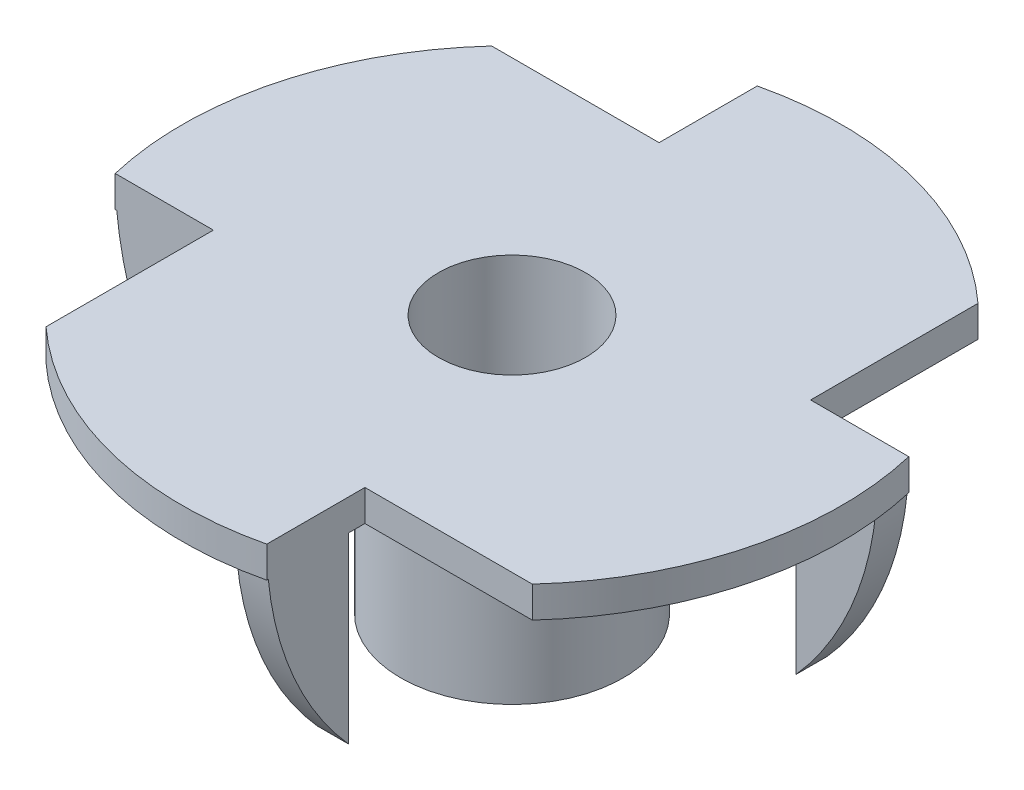
ISO-10303-21;
HEADER;
FILE_DESCRIPTION(('STEP AP214'),'2;1');
FILE_NAME('part.step','',(''),(''),'','','');
FILE_SCHEMA(('AUTOMOTIVE_DESIGN { 1 0 10303 214 1 1 1 1 }'));
ENDSEC;
DATA;
#1=APPLICATION_CONTEXT('core data for automotive mechanical design processes');
#2=APPLICATION_PROTOCOL_DEFINITION('international standard','automotive_design',2000,#1);
#3=PRODUCT_CONTEXT('',#1,'mechanical');
#4=PRODUCT('Part','Part','',(#3));
#5=PRODUCT_RELATED_PRODUCT_CATEGORY('part','',(#4));
#6=PRODUCT_DEFINITION_FORMATION('','',#4);
#7=PRODUCT_DEFINITION_CONTEXT('part definition',#1,'design');
#8=PRODUCT_DEFINITION('design','',#6,#7);
#9=PRODUCT_DEFINITION_SHAPE('','',#8);
#10=(LENGTH_UNIT() NAMED_UNIT(*) SI_UNIT(.MILLI.,.METRE.));
#11=(NAMED_UNIT(*) PLANE_ANGLE_UNIT() SI_UNIT($,.RADIAN.));
#12=(NAMED_UNIT(*) SI_UNIT($,.STERADIAN.) SOLID_ANGLE_UNIT());
#13=UNCERTAINTY_MEASURE_WITH_UNIT(LENGTH_MEASURE(1.E-05),#10,'distance_accuracy_value','');
#14=(GEOMETRIC_REPRESENTATION_CONTEXT(3) GLOBAL_UNCERTAINTY_ASSIGNED_CONTEXT((#13)) GLOBAL_UNIT_ASSIGNED_CONTEXT((#10,
#11,#12)) REPRESENTATION_CONTEXT('',''));
#15=CARTESIAN_POINT('',(0.,0.,0.));
#16=DIRECTION('',(0.,0.,1.));
#17=DIRECTION('',(1.,0.,0.));
#18=AXIS2_PLACEMENT_3D('',#15,#16,#17);
#19=CARTESIAN_POINT('',(0.,0.,0.));
#20=DIRECTION('',(0.,-1.,0.));
#21=DIRECTION('',(0.,0.,-1.));
#22=AXIS2_PLACEMENT_3D('',#19,#20,#21);
#23=CYLINDRICAL_SURFACE('',#22,7.4);
#24=DIRECTION('',(0.,-1.,0.));
#25=VECTOR('',#24,1.);
#26=CARTESIAN_POINT('',(-1.7,0.,-7.20208303201234));
#27=LINE('',#26,#25);
#28=CARTESIAN_POINT('',(-1.7,5.8,-7.20208303201234));
#29=VERTEX_POINT('',#28);
#30=CARTESIAN_POINT('',(-1.7,5.1,-7.20208303201234));
#31=VERTEX_POINT('',#30);
#32=EDGE_CURVE('E295',#29,#31,#27,.T.);
#33=ORIENTED_EDGE('',*,*,#32,.F.);
#34=CARTESIAN_POINT('',(0.,5.8,0.));
#35=DIRECTION('',(0.,-1.,0.));
#36=DIRECTION('',(0.,0.,-1.));
#37=AXIS2_PLACEMENT_3D('',#34,#35,#36);
#38=CIRCLE('',#37,7.4);
#39=CARTESIAN_POINT('',(5.,5.8,-5.45527267879434));
#40=VERTEX_POINT('',#39);
#41=EDGE_CURVE('E347',#29,#40,#38,.T.);
#42=ORIENTED_EDGE('',*,*,#41,.T.);
#43=DIRECTION('',(0.,-1.,0.));
#44=VECTOR('',#43,1.);
#45=CARTESIAN_POINT('',(5.,0.,-5.45527267879434));
#46=LINE('',#45,#44);
#47=CARTESIAN_POINT('',(5.,5.1,-5.45527267879434));
#48=VERTEX_POINT('',#47);
#49=EDGE_CURVE('E335',#48,#40,#46,.F.);
#50=ORIENTED_EDGE('',*,*,#49,.F.);
#51=CARTESIAN_POINT('',(0.,5.1,0.));
#52=DIRECTION('',(0.,-1.,0.));
#53=DIRECTION('',(0.,0.,-1.));
#54=AXIS2_PLACEMENT_3D('',#51,#52,#53);
#55=CIRCLE('',#54,7.4);
#56=EDGE_CURVE('E351',#31,#48,#55,.T.);
#57=ORIENTED_EDGE('',*,*,#56,.F.);
#58=EDGE_LOOP('',(#33,#42,#50,#57));
#59=FACE_BOUND('',#58,.T.);
#60=ADVANCED_FACE('F37',(#59),#23,.T.);
#61=DIRECTION('',(0.,-1.,0.));
#62=VECTOR('',#61,1.);
#63=CARTESIAN_POINT('',(-5.45527267879434,0.,-5.));
#64=LINE('',#63,#62);
#65=CARTESIAN_POINT('',(-5.45527267879434,5.1,-5.));
#66=VERTEX_POINT('',#65);
#67=CARTESIAN_POINT('',(-5.45527267879434,5.8,-5.));
#68=VERTEX_POINT('',#67);
#69=EDGE_CURVE('E289',#66,#68,#64,.F.);
#70=ORIENTED_EDGE('',*,*,#69,.F.);
#71=CARTESIAN_POINT('',(-7.20208303201234,5.1,1.7));
#72=VERTEX_POINT('',#71);
#73=EDGE_CURVE('E393',#72,#66,#55,.T.);
#74=ORIENTED_EDGE('',*,*,#73,.F.);
#75=DIRECTION('',(0.,-1.,0.));
#76=VECTOR('',#75,1.);
#77=CARTESIAN_POINT('',(-7.20208303201234,0.,1.7));
#78=LINE('',#77,#76);
#79=CARTESIAN_POINT('',(-7.20208303201234,5.8,1.7));
#80=VERTEX_POINT('',#79);
#81=EDGE_CURVE('E309',#80,#72,#78,.T.);
#82=ORIENTED_EDGE('',*,*,#81,.F.);
#83=EDGE_CURVE('E384',#80,#68,#38,.T.);
#84=ORIENTED_EDGE('',*,*,#83,.T.);
#85=EDGE_LOOP('',(#70,#74,#82,#84));
#86=FACE_BOUND('',#85,.T.);
#87=ADVANCED_FACE('F391',(#86),#23,.T.);
#88=DIRECTION('',(0.,-1.,0.));
#89=VECTOR('',#88,1.);
#90=CARTESIAN_POINT('',(-5.,0.,5.45527267879434));
#91=LINE('',#90,#89);
#92=CARTESIAN_POINT('',(-5.,5.1,5.45527267879434));
#93=VERTEX_POINT('',#92);
#94=CARTESIAN_POINT('',(-5.,5.8,5.45527267879434));
#95=VERTEX_POINT('',#94);
#96=EDGE_CURVE('E303',#93,#95,#91,.F.);
#97=ORIENTED_EDGE('',*,*,#96,.F.);
#98=CARTESIAN_POINT('',(1.7,5.1,7.20208303201234));
#99=VERTEX_POINT('',#98);
#100=EDGE_CURVE('E357',#99,#93,#55,.T.);
#101=ORIENTED_EDGE('',*,*,#100,.F.);
#102=DIRECTION('',(0.,-1.,0.));
#103=VECTOR('',#102,1.);
#104=CARTESIAN_POINT('',(1.7,0.,7.20208303201234));
#105=LINE('',#104,#103);
#106=CARTESIAN_POINT('',(1.7,5.8,7.20208303201234));
#107=VERTEX_POINT('',#106);
#108=EDGE_CURVE('E319',#107,#99,#105,.T.);
#109=ORIENTED_EDGE('',*,*,#108,.F.);
#110=EDGE_CURVE('E352',#107,#95,#38,.T.);
#111=ORIENTED_EDGE('',*,*,#110,.T.);
#112=EDGE_LOOP('',(#97,#101,#109,#111));
#113=FACE_BOUND('',#112,.T.);
#114=ADVANCED_FACE('F415',(#113),#23,.T.);
#115=CARTESIAN_POINT('',(0.,0.,0.));
#116=DIRECTION('',(0.,-1.,0.));
#117=DIRECTION('',(0.,0.,-1.));
#118=AXIS2_PLACEMENT_3D('',#115,#116,#117);
#119=PLANE('',#118);
#120=CARTESIAN_POINT('',(0.,0.,0.));
#121=DIRECTION('',(0.,-1.,0.));
#122=DIRECTION('',(0.,0.,-1.));
#123=AXIS2_PLACEMENT_3D('',#120,#121,#122);
#124=CIRCLE('',#123,1.65);
#125=CARTESIAN_POINT('',(0.,0.,-1.65));
#126=VERTEX_POINT('',#125);
#127=EDGE_CURVE('E344',#126,#126,#124,.T.);
#128=ORIENTED_EDGE('',*,*,#127,.F.);
#129=EDGE_LOOP('',(#128));
#130=FACE_BOUND('',#129,.T.);
#131=CARTESIAN_POINT('',(0.,0.,0.));
#132=DIRECTION('',(0.,-1.,0.));
#133=DIRECTION('',(0.,0.,-1.));
#134=AXIS2_PLACEMENT_3D('',#131,#132,#133);
#135=CIRCLE('',#134,2.5);
#136=CARTESIAN_POINT('',(0.,0.,-2.5));
#137=VERTEX_POINT('',#136);
#138=EDGE_CURVE('E360',#137,#137,#135,.T.);
#139=ORIENTED_EDGE('',*,*,#138,.T.);
#140=EDGE_LOOP('',(#139));
#141=FACE_BOUND('',#140,.T.);
#142=ADVANCED_FACE('F39',(#130,#141),#119,.T.);
#143=CARTESIAN_POINT('',(0.,0.,0.));
#144=DIRECTION('',(0.,-1.,0.));
#145=DIRECTION('',(0.,0.,-1.));
#146=AXIS2_PLACEMENT_3D('',#143,#144,#145);
#147=CYLINDRICAL_SURFACE('',#146,2.5);
#148=CARTESIAN_POINT('',(0.,5.1,0.));
#149=DIRECTION('',(0.,-1.,0.));
#150=DIRECTION('',(0.,0.,-1.));
#151=AXIS2_PLACEMENT_3D('',#148,#149,#150);
#152=CIRCLE('',#151,2.5);
#153=CARTESIAN_POINT('',(0.,5.1,-2.5));
#154=VERTEX_POINT('',#153);
#155=EDGE_CURVE('E356',#154,#154,#152,.T.);
#156=ORIENTED_EDGE('',*,*,#155,.T.);
#157=EDGE_LOOP('',(#156));
#158=FACE_BOUND('',#157,.T.);
#159=ORIENTED_EDGE('',*,*,#138,.F.);
#160=EDGE_LOOP('',(#159));
#161=FACE_BOUND('',#160,.T.);
#162=ADVANCED_FACE('F472',(#158,#161),#147,.T.);
#163=CARTESIAN_POINT('',(2.5,5.1,0.));
#164=DIRECTION('',(0.,-1.,0.));
#165=DIRECTION('',(0.,0.,-1.));
#166=AXIS2_PLACEMENT_3D('',#163,#164,#165);
#167=PLANE('',#166);
#168=DIRECTION('',(1.,0.,0.));
#169=VECTOR('',#168,1.);
#170=CARTESIAN_POINT('',(1.00000000000007,5.1,7.16798437498296));
#171=LINE('',#170,#169);
#172=CARTESIAN_POINT('',(1.70000000000007,5.1,7.16798437498295));
#173=VERTEX_POINT('',#172);
#174=CARTESIAN_POINT('',(1.00000000000007,5.1,7.16798437498296));
#175=VERTEX_POINT('',#174);
#176=EDGE_CURVE('E203',#173,#175,#171,.F.);
#177=ORIENTED_EDGE('',*,*,#176,.F.);
#178=DIRECTION('',(0.,0.,-1.));
#179=VECTOR('',#178,1.);
#180=CARTESIAN_POINT('',(1.7,5.1,0.));
#181=LINE('',#180,#179);
#182=EDGE_CURVE('E322',#99,#173,#181,.T.);
#183=ORIENTED_EDGE('',*,*,#182,.F.);
#184=ORIENTED_EDGE('',*,*,#100,.T.);
#185=DIRECTION('',(0.,0.,1.));
#186=VECTOR('',#185,1.);
#187=CARTESIAN_POINT('',(-5.,5.1,0.));
#188=LINE('',#187,#186);
#189=CARTESIAN_POINT('',(-5.,5.1,1.7));
#190=VERTEX_POINT('',#189);
#191=EDGE_CURVE('E301',#190,#93,#188,.T.);
#192=ORIENTED_EDGE('',*,*,#191,.F.);
#193=DIRECTION('',(1.,0.,0.));
#194=VECTOR('',#193,1.);
#195=CARTESIAN_POINT('',(2.5,5.1,1.7));
#196=LINE('',#195,#194);
#197=CARTESIAN_POINT('',(-5.36935750346352,5.1,1.7));
#198=VERTEX_POINT('',#197);
#199=EDGE_CURVE('E305',#198,#190,#196,.T.);
#200=ORIENTED_EDGE('',*,*,#199,.F.);
#201=DIRECTION('',(0.,0.,1.));
#202=VECTOR('',#201,1.);
#203=CARTESIAN_POINT('',(-5.36935750346352,5.1,0.));
#204=LINE('',#203,#202);
#205=CARTESIAN_POINT('',(-5.36935750346352,5.1,0.999999999999999));
#206=VERTEX_POINT('',#205);
#207=EDGE_CURVE('E236',#206,#198,#204,.T.);
#208=ORIENTED_EDGE('',*,*,#207,.F.);
#209=DIRECTION('',(-1.,0.,0.));
#210=VECTOR('',#209,1.);
#211=CARTESIAN_POINT('',(2.5,5.1,1.));
#212=LINE('',#211,#210);
#213=CARTESIAN_POINT('',(-7.16798437498297,5.1,0.999999999999998));
#214=VERTEX_POINT('',#213);
#215=EDGE_CURVE('E240',#206,#214,#212,.T.);
#216=ORIENTED_EDGE('',*,*,#215,.T.);
#217=DIRECTION('',(0.,0.,1.));
#218=VECTOR('',#217,1.);
#219=CARTESIAN_POINT('',(-7.16798437498297,5.1,0.999999999999998));
#220=LINE('',#219,#218);
#221=CARTESIAN_POINT('',(-7.16798437498297,5.1,1.7));
#222=VERTEX_POINT('',#221);
#223=EDGE_CURVE('E238',#222,#214,#220,.F.);
#224=ORIENTED_EDGE('',*,*,#223,.F.);
#225=EDGE_CURVE('E306',#72,#222,#196,.T.);
#226=ORIENTED_EDGE('',*,*,#225,.F.);
#227=ORIENTED_EDGE('',*,*,#73,.T.);
#228=DIRECTION('',(-1.,0.,0.));
#229=VECTOR('',#228,1.);
#230=CARTESIAN_POINT('',(2.5,5.1,-5.));
#231=LINE('',#230,#229);
#232=CARTESIAN_POINT('',(-1.7,5.1,-5.));
#233=VERTEX_POINT('',#232);
#234=EDGE_CURVE('E287',#233,#66,#231,.T.);
#235=ORIENTED_EDGE('',*,*,#234,.F.);
#236=DIRECTION('',(0.,0.,1.));
#237=VECTOR('',#236,1.);
#238=CARTESIAN_POINT('',(-1.7,5.1,0.));
#239=LINE('',#238,#237);
#240=CARTESIAN_POINT('',(-1.7,5.1,-5.36935750346352));
#241=VERTEX_POINT('',#240);
#242=EDGE_CURVE('E291',#241,#233,#239,.T.);
#243=ORIENTED_EDGE('',*,*,#242,.F.);
#244=DIRECTION('',(-1.,0.,0.));
#245=VECTOR('',#244,1.);
#246=CARTESIAN_POINT('',(2.49999999999998,5.1,-5.36935750346353));
#247=LINE('',#246,#245);
#248=CARTESIAN_POINT('',(-1.00000000000002,5.1,-5.36935750346352));
#249=VERTEX_POINT('',#248);
#250=EDGE_CURVE('E255',#249,#241,#247,.T.);
#251=ORIENTED_EDGE('',*,*,#250,.F.);
#252=DIRECTION('',(0.,0.,-1.));
#253=VECTOR('',#252,1.);
#254=CARTESIAN_POINT('',(-1.,5.1,0.));
#255=LINE('',#254,#253);
#256=CARTESIAN_POINT('',(-1.00000000000002,5.1,-7.16798437498297));
#257=VERTEX_POINT('',#256);
#258=EDGE_CURVE('E260',#249,#257,#255,.T.);
#259=ORIENTED_EDGE('',*,*,#258,.T.);
#260=DIRECTION('',(-1.,0.,0.));
#261=VECTOR('',#260,1.);
#262=CARTESIAN_POINT('',(-1.00000000000002,5.1,-7.16798437498297));
#263=LINE('',#262,#261);
#264=CARTESIAN_POINT('',(-1.70000000000002,5.1,-7.16798437498296));
#265=VERTEX_POINT('',#264);
#266=EDGE_CURVE('E258',#265,#257,#263,.F.);
#267=ORIENTED_EDGE('',*,*,#266,.F.);
#268=EDGE_CURVE('E292',#31,#265,#239,.T.);
#269=ORIENTED_EDGE('',*,*,#268,.F.);
#270=ORIENTED_EDGE('',*,*,#56,.T.);
#271=DIRECTION('',(0.,0.,-1.));
#272=VECTOR('',#271,1.);
#273=CARTESIAN_POINT('',(5.,5.1,0.));
#274=LINE('',#273,#272);
#275=CARTESIAN_POINT('',(5.,5.1,-1.7));
#276=VERTEX_POINT('',#275);
#277=EDGE_CURVE('E338',#276,#48,#274,.T.);
#278=ORIENTED_EDGE('',*,*,#277,.F.);
#279=DIRECTION('',(-1.,0.,0.));
#280=VECTOR('',#279,1.);
#281=CARTESIAN_POINT('',(2.5,5.1,-1.7));
#282=LINE('',#281,#280);
#283=CARTESIAN_POINT('',(5.36935750346352,5.1,-1.7));
#284=VERTEX_POINT('',#283);
#285=EDGE_CURVE('E331',#284,#276,#282,.T.);
#286=ORIENTED_EDGE('',*,*,#285,.F.);
#287=DIRECTION('',(0.,0.,-1.));
#288=VECTOR('',#287,1.);
#289=CARTESIAN_POINT('',(5.36935750346352,5.1,0.));
#290=LINE('',#289,#288);
#291=CARTESIAN_POINT('',(5.36935750346352,5.1,-0.999999999999999));
#292=VERTEX_POINT('',#291);
#293=EDGE_CURVE('E275',#292,#284,#290,.T.);
#294=ORIENTED_EDGE('',*,*,#293,.F.);
#295=DIRECTION('',(1.,0.,0.));
#296=VECTOR('',#295,1.);
#297=CARTESIAN_POINT('',(2.5,5.1,-0.999999999999999));
#298=LINE('',#297,#296);
#299=CARTESIAN_POINT('',(7.16798437498297,5.1,-0.999999999999998));
#300=VERTEX_POINT('',#299);
#301=EDGE_CURVE('E280',#292,#300,#298,.T.);
#302=ORIENTED_EDGE('',*,*,#301,.T.);
#303=DIRECTION('',(0.,0.,-1.));
#304=VECTOR('',#303,1.);
#305=CARTESIAN_POINT('',(7.16798437498297,5.1,-0.999999999999998));
#306=LINE('',#305,#304);
#307=CARTESIAN_POINT('',(7.16798437498297,5.1,-1.7));
#308=VERTEX_POINT('',#307);
#309=EDGE_CURVE('E278',#308,#300,#306,.F.);
#310=ORIENTED_EDGE('',*,*,#309,.F.);
#311=CARTESIAN_POINT('',(7.20208303201234,5.1,-1.7));
#312=VERTEX_POINT('',#311);
#313=EDGE_CURVE('E332',#312,#308,#282,.T.);
#314=ORIENTED_EDGE('',*,*,#313,.F.);
#315=CARTESIAN_POINT('',(5.45527267879434,5.1,5.));
#316=VERTEX_POINT('',#315);
#317=EDGE_CURVE('E353',#312,#316,#55,.T.);
#318=ORIENTED_EDGE('',*,*,#317,.T.);
#319=DIRECTION('',(1.,0.,0.));
#320=VECTOR('',#319,1.);
#321=CARTESIAN_POINT('',(2.5,5.1,5.));
#322=LINE('',#321,#320);
#323=CARTESIAN_POINT('',(1.7,5.1,5.));
#324=VERTEX_POINT('',#323);
#325=EDGE_CURVE('E317',#324,#316,#322,.T.);
#326=ORIENTED_EDGE('',*,*,#325,.F.);
#327=CARTESIAN_POINT('',(1.7,5.1,5.3693575034635));
#328=VERTEX_POINT('',#327);
#329=EDGE_CURVE('E321',#328,#324,#181,.T.);
#330=ORIENTED_EDGE('',*,*,#329,.F.);
#331=DIRECTION('',(1.,0.,0.));
#332=VECTOR('',#331,1.);
#333=CARTESIAN_POINT('',(2.50000000000006,5.1,5.36935750346349));
#334=LINE('',#333,#332);
#335=CARTESIAN_POINT('',(1.00000000000005,5.1,5.36935750346351));
#336=VERTEX_POINT('',#335);
#337=EDGE_CURVE('E213',#336,#328,#334,.T.);
#338=ORIENTED_EDGE('',*,*,#337,.F.);
#339=DIRECTION('',(0.,0.,1.));
#340=VECTOR('',#339,1.);
#341=CARTESIAN_POINT('',(1.,5.1,0.));
#342=LINE('',#341,#340);
#343=EDGE_CURVE('E216',#336,#175,#342,.T.);
#344=ORIENTED_EDGE('',*,*,#343,.T.);
#345=EDGE_LOOP('',(#177,#183,#184,#192,#200,#208,#216,#224,#226,#227,#235,#243,#251,#259,#267,
#269,#270,#278,#286,#294,#302,#310,#314,#318,#326,#330,#338,#344));
#346=FACE_BOUND('',#345,.T.);
#347=ORIENTED_EDGE('',*,*,#155,.F.);
#348=EDGE_LOOP('',(#347));
#349=FACE_BOUND('',#348,.T.);
#350=ADVANCED_FACE('F400',(#346,#349),#167,.T.);
#351=DIRECTION('',(0.,-1.,0.));
#352=VECTOR('',#351,1.);
#353=CARTESIAN_POINT('',(5.45527267879434,0.,5.));
#354=LINE('',#353,#352);
#355=CARTESIAN_POINT('',(5.45527267879434,5.8,5.));
#356=VERTEX_POINT('',#355);
#357=EDGE_CURVE('E315',#316,#356,#354,.F.);
#358=ORIENTED_EDGE('',*,*,#357,.F.);
#359=ORIENTED_EDGE('',*,*,#317,.F.);
#360=DIRECTION('',(0.,-1.,0.));
#361=VECTOR('',#360,1.);
#362=CARTESIAN_POINT('',(7.20208303201234,0.,-1.7));
#363=LINE('',#362,#361);
#364=CARTESIAN_POINT('',(7.20208303201234,5.8,-1.7));
#365=VERTEX_POINT('',#364);
#366=EDGE_CURVE('E329',#365,#312,#363,.T.);
#367=ORIENTED_EDGE('',*,*,#366,.F.);
#368=EDGE_CURVE('E348',#365,#356,#38,.T.);
#369=ORIENTED_EDGE('',*,*,#368,.T.);
#370=EDGE_LOOP('',(#358,#359,#367,#369));
#371=FACE_BOUND('',#370,.T.);
#372=ADVANCED_FACE('F430',(#371),#23,.T.);
#373=CARTESIAN_POINT('',(7.4,5.8,0.));
#374=DIRECTION('',(0.,1.,0.));
#375=DIRECTION('',(0.,0.,1.));
#376=AXIS2_PLACEMENT_3D('',#373,#374,#375);
#377=PLANE('',#376);
#378=ORIENTED_EDGE('',*,*,#110,.F.);
#379=DIRECTION('',(0.,0.,1.));
#380=VECTOR('',#379,1.);
#381=CARTESIAN_POINT('',(1.7,5.8,5.));
#382=LINE('',#381,#380);
#383=CARTESIAN_POINT('',(1.7,5.8,5.));
#384=VERTEX_POINT('',#383);
#385=EDGE_CURVE('E311',#384,#107,#382,.T.);
#386=ORIENTED_EDGE('',*,*,#385,.F.);
#387=DIRECTION('',(-1.,0.,0.));
#388=VECTOR('',#387,1.);
#389=CARTESIAN_POINT('',(7.4,5.8,5.));
#390=LINE('',#389,#388);
#391=EDGE_CURVE('E366',#356,#384,#390,.T.);
#392=ORIENTED_EDGE('',*,*,#391,.F.);
#393=ORIENTED_EDGE('',*,*,#368,.F.);
#394=DIRECTION('',(1.,0.,0.));
#395=VECTOR('',#394,1.);
#396=CARTESIAN_POINT('',(5.,5.8,-1.7));
#397=LINE('',#396,#395);
#398=CARTESIAN_POINT('',(5.,5.8,-1.7));
#399=VERTEX_POINT('',#398);
#400=EDGE_CURVE('E325',#399,#365,#397,.T.);
#401=ORIENTED_EDGE('',*,*,#400,.F.);
#402=DIRECTION('',(0.,0.,1.));
#403=VECTOR('',#402,1.);
#404=CARTESIAN_POINT('',(5.,5.8,0.));
#405=LINE('',#404,#403);
#406=EDGE_CURVE('E363',#40,#399,#405,.T.);
#407=ORIENTED_EDGE('',*,*,#406,.F.);
#408=ORIENTED_EDGE('',*,*,#41,.F.);
#409=DIRECTION('',(0.,0.,-1.));
#410=VECTOR('',#409,1.);
#411=CARTESIAN_POINT('',(-1.7,5.8,-5.));
#412=LINE('',#411,#410);
#413=CARTESIAN_POINT('',(-1.7,5.8,-5.));
#414=VERTEX_POINT('',#413);
#415=EDGE_CURVE('E283',#414,#29,#412,.T.);
#416=ORIENTED_EDGE('',*,*,#415,.F.);
#417=DIRECTION('',(1.,0.,0.));
#418=VECTOR('',#417,1.);
#419=CARTESIAN_POINT('',(7.4,5.8,-5.));
#420=LINE('',#419,#418);
#421=EDGE_CURVE('E11',#68,#414,#420,.T.);
#422=ORIENTED_EDGE('',*,*,#421,.F.);
#423=ORIENTED_EDGE('',*,*,#83,.F.);
#424=DIRECTION('',(-1.,0.,0.));
#425=VECTOR('',#424,1.);
#426=CARTESIAN_POINT('',(-5.,5.8,1.7));
#427=LINE('',#426,#425);
#428=CARTESIAN_POINT('',(-5.,5.8,1.7));
#429=VERTEX_POINT('',#428);
#430=EDGE_CURVE('E297',#429,#80,#427,.T.);
#431=ORIENTED_EDGE('',*,*,#430,.F.);
#432=DIRECTION('',(0.,0.,-1.));
#433=VECTOR('',#432,1.);
#434=CARTESIAN_POINT('',(-5.,5.8,0.));
#435=LINE('',#434,#433);
#436=EDGE_CURVE('E45',#95,#429,#435,.T.);
#437=ORIENTED_EDGE('',*,*,#436,.F.);
#438=EDGE_LOOP('',(#378,#386,#392,#393,#401,#407,#408,#416,#422,#423,#431,#437));
#439=FACE_BOUND('',#438,.T.);
#440=CARTESIAN_POINT('',(0.,5.8,0.));
#441=DIRECTION('',(0.,1.,0.));
#442=DIRECTION('',(0.,0.,1.));
#443=AXIS2_PLACEMENT_3D('',#440,#441,#442);
#444=CIRCLE('',#443,1.65);
#445=CARTESIAN_POINT('',(0.,5.8,1.65));
#446=VERTEX_POINT('',#445);
#447=EDGE_CURVE('E341',#446,#446,#444,.T.);
#448=ORIENTED_EDGE('',*,*,#447,.F.);
#449=EDGE_LOOP('',(#448));
#450=FACE_BOUND('',#449,.T.);
#451=ADVANCED_FACE('F380',(#439,#450),#377,.T.);
#452=CARTESIAN_POINT('',(0.,5.8,0.));
#453=DIRECTION('',(0.,1.,0.));
#454=DIRECTION('',(0.,0.,1.));
#455=AXIS2_PLACEMENT_3D('',#452,#453,#454);
#456=CYLINDRICAL_SURFACE('',#455,1.65);
#457=ORIENTED_EDGE('',*,*,#127,.T.);
#458=EDGE_LOOP('',(#457));
#459=FACE_BOUND('',#458,.T.);
#460=ORIENTED_EDGE('',*,*,#447,.T.);
#461=EDGE_LOOP('',(#460));
#462=FACE_BOUND('',#461,.T.);
#463=ADVANCED_FACE('F471',(#459,#462),#456,.F.);
#464=CARTESIAN_POINT('',(5.,-4.2,-1.7));
#465=DIRECTION('',(-1.,0.,0.));
#466=DIRECTION('',(0.,0.,1.));
#467=AXIS2_PLACEMENT_3D('',#464,#465,#466);
#468=PLANE('',#467);
#469=ORIENTED_EDGE('',*,*,#277,.T.);
#470=ORIENTED_EDGE('',*,*,#49,.T.);
#471=ORIENTED_EDGE('',*,*,#406,.T.);
#472=DIRECTION('',(0.,1.,0.));
#473=VECTOR('',#472,1.);
#474=CARTESIAN_POINT('',(5.,-4.2,-1.7));
#475=LINE('',#474,#473);
#476=EDGE_CURVE('E327',#276,#399,#475,.T.);
#477=ORIENTED_EDGE('',*,*,#476,.F.);
#478=EDGE_LOOP('',(#469,#470,#471,#477));
#479=FACE_BOUND('',#478,.T.);
#480=ADVANCED_FACE('F409',(#479),#468,.F.);
#481=CARTESIAN_POINT('',(5.,-4.2,-1.7));
#482=DIRECTION('',(0.,0.,1.));
#483=DIRECTION('',(1.,0.,0.));
#484=AXIS2_PLACEMENT_3D('',#481,#482,#483);
#485=PLANE('',#484);
#486=ORIENTED_EDGE('',*,*,#400,.T.);
#487=ORIENTED_EDGE('',*,*,#366,.T.);
#488=ORIENTED_EDGE('',*,*,#313,.T.);
#489=CARTESIAN_POINT('',(0.,5.8,-1.7));
#490=DIRECTION('',(0.,0.,-1.));
#491=DIRECTION('',(-1.,0.,0.));
#492=AXIS2_PLACEMENT_3D('',#489,#490,#491);
#493=CIRCLE('',#492,7.20208303201234);
#494=CARTESIAN_POINT('',(5.36935750346352,1.,-1.7));
#495=VERTEX_POINT('',#494);
#496=EDGE_CURVE('E263',#308,#495,#493,.T.);
#497=ORIENTED_EDGE('',*,*,#496,.T.);
#498=DIRECTION('',(0.,1.,0.));
#499=VECTOR('',#498,1.);
#500=CARTESIAN_POINT('',(5.36935750346352,1.,-1.7));
#501=LINE('',#500,#499);
#502=EDGE_CURVE('E267',#495,#284,#501,.T.);
#503=ORIENTED_EDGE('',*,*,#502,.T.);
#504=ORIENTED_EDGE('',*,*,#285,.T.);
#505=ORIENTED_EDGE('',*,*,#476,.T.);
#506=EDGE_LOOP('',(#486,#487,#488,#497,#503,#504,#505));
#507=FACE_BOUND('',#506,.T.);
#508=ADVANCED_FACE('F435',(#507),#485,.F.);
#509=CARTESIAN_POINT('',(1.7,-4.2,5.));
#510=DIRECTION('',(-1.,0.,0.));
#511=DIRECTION('',(0.,0.,1.));
#512=AXIS2_PLACEMENT_3D('',#509,#510,#511);
#513=PLANE('',#512);
#514=ORIENTED_EDGE('',*,*,#385,.T.);
#515=ORIENTED_EDGE('',*,*,#108,.T.);
#516=ORIENTED_EDGE('',*,*,#182,.T.);
#517=CARTESIAN_POINT('',(1.7,5.8,0.));
#518=DIRECTION('',(1.,0.,0.));
#519=DIRECTION('',(0.,0.,-1.));
#520=AXIS2_PLACEMENT_3D('',#517,#518,#519);
#521=CIRCLE('',#520,7.20208303201234);
#522=CARTESIAN_POINT('',(1.70000000000005,1.,5.3693575034635));
#523=VERTEX_POINT('',#522);
#524=EDGE_CURVE('E219',#173,#523,#521,.T.);
#525=ORIENTED_EDGE('',*,*,#524,.T.);
#526=DIRECTION('',(0.,1.,0.));
#527=VECTOR('',#526,1.);
#528=CARTESIAN_POINT('',(1.70000000000005,1.,5.3693575034635));
#529=LINE('',#528,#527);
#530=EDGE_CURVE('E52',#523,#328,#529,.T.);
#531=ORIENTED_EDGE('',*,*,#530,.T.);
#532=ORIENTED_EDGE('',*,*,#329,.T.);
#533=DIRECTION('',(0.,1.,0.));
#534=VECTOR('',#533,1.);
#535=CARTESIAN_POINT('',(1.7,-4.2,5.));
#536=LINE('',#535,#534);
#537=EDGE_CURVE('E313',#324,#384,#536,.T.);
#538=ORIENTED_EDGE('',*,*,#537,.T.);
#539=EDGE_LOOP('',(#514,#515,#516,#525,#531,#532,#538));
#540=FACE_BOUND('',#539,.T.);
#541=ADVANCED_FACE('F420',(#540),#513,.F.);
#542=CARTESIAN_POINT('',(1.7,-4.2,5.));
#543=DIRECTION('',(0.,0.,-1.));
#544=DIRECTION('',(-1.,0.,0.));
#545=AXIS2_PLACEMENT_3D('',#542,#543,#544);
#546=PLANE('',#545);
#547=ORIENTED_EDGE('',*,*,#325,.T.);
#548=ORIENTED_EDGE('',*,*,#357,.T.);
#549=ORIENTED_EDGE('',*,*,#391,.T.);
#550=ORIENTED_EDGE('',*,*,#537,.F.);
#551=EDGE_LOOP('',(#547,#548,#549,#550));
#552=FACE_BOUND('',#551,.T.);
#553=ADVANCED_FACE('F426',(#552),#546,.F.);
#554=CARTESIAN_POINT('',(-5.,-4.2,1.7));
#555=DIRECTION('',(0.,0.,-1.));
#556=DIRECTION('',(-1.,0.,0.));
#557=AXIS2_PLACEMENT_3D('',#554,#555,#556);
#558=PLANE('',#557);
#559=ORIENTED_EDGE('',*,*,#430,.T.);
#560=ORIENTED_EDGE('',*,*,#81,.T.);
#561=ORIENTED_EDGE('',*,*,#225,.T.);
#562=CARTESIAN_POINT('',(0.,5.8,1.7));
#563=DIRECTION('',(0.,0.,1.));
#564=DIRECTION('',(1.,0.,0.));
#565=AXIS2_PLACEMENT_3D('',#562,#563,#564);
#566=CIRCLE('',#565,7.20208303201234);
#567=CARTESIAN_POINT('',(-5.36935750346352,1.,1.7));
#568=VERTEX_POINT('',#567);
#569=EDGE_CURVE('E225',#222,#568,#566,.T.);
#570=ORIENTED_EDGE('',*,*,#569,.T.);
#571=DIRECTION('',(0.,1.,0.));
#572=VECTOR('',#571,1.);
#573=CARTESIAN_POINT('',(-5.36935750346352,1.,1.7));
#574=LINE('',#573,#572);
#575=EDGE_CURVE('E60',#568,#198,#574,.T.);
#576=ORIENTED_EDGE('',*,*,#575,.T.);
#577=ORIENTED_EDGE('',*,*,#199,.T.);
#578=DIRECTION('',(0.,1.,0.));
#579=VECTOR('',#578,1.);
#580=CARTESIAN_POINT('',(-5.,-4.2,1.7));
#581=LINE('',#580,#579);
#582=EDGE_CURVE('E299',#190,#429,#581,.T.);
#583=ORIENTED_EDGE('',*,*,#582,.T.);
#584=EDGE_LOOP('',(#559,#560,#561,#570,#576,#577,#583));
#585=FACE_BOUND('',#584,.T.);
#586=ADVANCED_FACE('F386',(#585),#558,.F.);
#587=CARTESIAN_POINT('',(-5.,-4.2,1.7));
#588=DIRECTION('',(1.,0.,0.));
#589=DIRECTION('',(0.,0.,-1.));
#590=AXIS2_PLACEMENT_3D('',#587,#588,#589);
#591=PLANE('',#590);
#592=ORIENTED_EDGE('',*,*,#96,.T.);
#593=ORIENTED_EDGE('',*,*,#436,.T.);
#594=ORIENTED_EDGE('',*,*,#582,.F.);
#595=ORIENTED_EDGE('',*,*,#191,.T.);
#596=EDGE_LOOP('',(#592,#593,#594,#595));
#597=FACE_BOUND('',#596,.T.);
#598=ADVANCED_FACE('F373',(#597),#591,.F.);
#599=CARTESIAN_POINT('',(-1.7,-4.2,-5.));
#600=DIRECTION('',(1.,0.,0.));
#601=DIRECTION('',(0.,0.,-1.));
#602=AXIS2_PLACEMENT_3D('',#599,#600,#601);
#603=PLANE('',#602);
#604=ORIENTED_EDGE('',*,*,#415,.T.);
#605=ORIENTED_EDGE('',*,*,#32,.T.);
#606=ORIENTED_EDGE('',*,*,#268,.T.);
#607=CARTESIAN_POINT('',(-1.7,5.8,0.));
#608=DIRECTION('',(-1.,0.,0.));
#609=DIRECTION('',(0.,0.,1.));
#610=AXIS2_PLACEMENT_3D('',#607,#608,#609);
#611=CIRCLE('',#610,7.20208303201234);
#612=CARTESIAN_POINT('',(-1.70000000000002,1.,-5.36935750346352));
#613=VERTEX_POINT('',#612);
#614=EDGE_CURVE('E243',#265,#613,#611,.T.);
#615=ORIENTED_EDGE('',*,*,#614,.T.);
#616=DIRECTION('',(0.,1.,0.));
#617=VECTOR('',#616,1.);
#618=CARTESIAN_POINT('',(-1.70000000000002,1.,-5.36935750346352));
#619=LINE('',#618,#617);
#620=EDGE_CURVE('E247',#613,#241,#619,.T.);
#621=ORIENTED_EDGE('',*,*,#620,.T.);
#622=ORIENTED_EDGE('',*,*,#242,.T.);
#623=DIRECTION('',(0.,1.,0.));
#624=VECTOR('',#623,1.);
#625=CARTESIAN_POINT('',(-1.7,-4.2,-5.));
#626=LINE('',#625,#624);
#627=EDGE_CURVE('E285',#233,#414,#626,.T.);
#628=ORIENTED_EDGE('',*,*,#627,.T.);
#629=EDGE_LOOP('',(#604,#605,#606,#615,#621,#622,#628));
#630=FACE_BOUND('',#629,.T.);
#631=ADVANCED_FACE('F456',(#630),#603,.F.);
#632=CARTESIAN_POINT('',(-1.7,-4.2,-5.));
#633=DIRECTION('',(0.,0.,1.));
#634=DIRECTION('',(1.,0.,0.));
#635=AXIS2_PLACEMENT_3D('',#632,#633,#634);
#636=PLANE('',#635);
#637=ORIENTED_EDGE('',*,*,#69,.T.);
#638=ORIENTED_EDGE('',*,*,#421,.T.);
#639=ORIENTED_EDGE('',*,*,#627,.F.);
#640=ORIENTED_EDGE('',*,*,#234,.T.);
#641=EDGE_LOOP('',(#637,#638,#639,#640));
#642=FACE_BOUND('',#641,.T.);
#643=ADVANCED_FACE('F449',(#642),#636,.F.);
#644=CARTESIAN_POINT('',(0.,5.8,-1.));
#645=DIRECTION('',(0.,0.,-1.));
#646=DIRECTION('',(-1.,0.,0.));
#647=AXIS2_PLACEMENT_3D('',#644,#645,#646);
#648=CYLINDRICAL_SURFACE('',#647,7.20208303201234);
#649=ORIENTED_EDGE('',*,*,#496,.F.);
#650=ORIENTED_EDGE('',*,*,#309,.T.);
#651=CARTESIAN_POINT('',(0.,5.8,-1.));
#652=DIRECTION('',(0.,0.,-1.));
#653=DIRECTION('',(-1.,0.,0.));
#654=AXIS2_PLACEMENT_3D('',#651,#652,#653);
#655=CIRCLE('',#654,7.20208303201234);
#656=CARTESIAN_POINT('',(5.36935750346352,1.,-0.999999999999999));
#657=VERTEX_POINT('',#656);
#658=EDGE_CURVE('E264',#300,#657,#655,.T.);
#659=ORIENTED_EDGE('',*,*,#658,.T.);
#660=DIRECTION('',(0.,0.,-1.));
#661=VECTOR('',#660,1.);
#662=CARTESIAN_POINT('',(5.36935750346352,1.,-0.999999999999999));
#663=LINE('',#662,#661);
#664=EDGE_CURVE('E270',#657,#495,#663,.T.);
#665=ORIENTED_EDGE('',*,*,#664,.T.);
#666=EDGE_LOOP('',(#649,#650,#659,#665));
#667=FACE_BOUND('',#666,.T.);
#668=ADVANCED_FACE('F447',(#667),#648,.T.);
#669=CARTESIAN_POINT('',(5.36935750346352,1.,-0.999999999999999));
#670=DIRECTION('',(-1.,0.,0.));
#671=DIRECTION('',(0.,0.,1.));
#672=AXIS2_PLACEMENT_3D('',#669,#670,#671);
#673=PLANE('',#672);
#674=DIRECTION('',(0.,1.,0.));
#675=VECTOR('',#674,1.);
#676=CARTESIAN_POINT('',(5.36935750346352,1.,-0.999999999999999));
#677=LINE('',#676,#675);
#678=EDGE_CURVE('E266',#657,#292,#677,.T.);
#679=ORIENTED_EDGE('',*,*,#678,.T.);
#680=ORIENTED_EDGE('',*,*,#293,.T.);
#681=ORIENTED_EDGE('',*,*,#502,.F.);
#682=ORIENTED_EDGE('',*,*,#664,.F.);
#683=EDGE_LOOP('',(#679,#680,#681,#682));
#684=FACE_BOUND('',#683,.T.);
#685=ADVANCED_FACE('F440',(#684),#673,.T.);
#686=CARTESIAN_POINT('',(0.,5.8,-1.));
#687=DIRECTION('',(0.,0.,-1.));
#688=DIRECTION('',(-1.,0.,0.));
#689=AXIS2_PLACEMENT_3D('',#686,#687,#688);
#690=PLANE('',#689);
#691=ORIENTED_EDGE('',*,*,#301,.F.);
#692=ORIENTED_EDGE('',*,*,#678,.F.);
#693=ORIENTED_EDGE('',*,*,#658,.F.);
#694=EDGE_LOOP('',(#691,#692,#693));
#695=FACE_BOUND('',#694,.T.);
#696=ADVANCED_FACE('F445',(#695),#690,.F.);
#697=CARTESIAN_POINT('',(-1.,5.8,0.));
#698=DIRECTION('',(-1.,0.,0.));
#699=DIRECTION('',(0.,0.,1.));
#700=AXIS2_PLACEMENT_3D('',#697,#698,#699);
#701=CYLINDRICAL_SURFACE('',#700,7.20208303201234);
#702=ORIENTED_EDGE('',*,*,#614,.F.);
#703=ORIENTED_EDGE('',*,*,#266,.T.);
#704=CARTESIAN_POINT('',(-1.,5.8,0.));
#705=DIRECTION('',(-1.,0.,0.));
#706=DIRECTION('',(0.,0.,1.));
#707=AXIS2_PLACEMENT_3D('',#704,#705,#706);
#708=CIRCLE('',#707,7.20208303201234);
#709=CARTESIAN_POINT('',(-1.00000000000002,1.,-5.36935750346352));
#710=VERTEX_POINT('',#709);
#711=EDGE_CURVE('E244',#257,#710,#708,.T.);
#712=ORIENTED_EDGE('',*,*,#711,.T.);
#713=DIRECTION('',(-1.,0.,0.));
#714=VECTOR('',#713,1.);
#715=CARTESIAN_POINT('',(-1.00000000000002,1.,-5.36935750346352));
#716=LINE('',#715,#714);
#717=EDGE_CURVE('E250',#710,#613,#716,.T.);
#718=ORIENTED_EDGE('',*,*,#717,.T.);
#719=EDGE_LOOP('',(#702,#703,#712,#718));
#720=FACE_BOUND('',#719,.T.);
#721=ADVANCED_FACE('F522',(#720),#701,.T.);
#722=CARTESIAN_POINT('',(-1.00000000000002,1.,-5.36935750346352));
#723=DIRECTION('',(0.,0.,1.));
#724=DIRECTION('',(1.,0.,0.));
#725=AXIS2_PLACEMENT_3D('',#722,#723,#724);
#726=PLANE('',#725);
#727=DIRECTION('',(0.,1.,0.));
#728=VECTOR('',#727,1.);
#729=CARTESIAN_POINT('',(-1.00000000000002,1.,-5.36935750346352));
#730=LINE('',#729,#728);
#731=EDGE_CURVE('E246',#710,#249,#730,.T.);
#732=ORIENTED_EDGE('',*,*,#731,.T.);
#733=ORIENTED_EDGE('',*,*,#250,.T.);
#734=ORIENTED_EDGE('',*,*,#620,.F.);
#735=ORIENTED_EDGE('',*,*,#717,.F.);
#736=EDGE_LOOP('',(#732,#733,#734,#735));
#737=FACE_BOUND('',#736,.T.);
#738=ADVANCED_FACE('F516',(#737),#726,.T.);
#739=CARTESIAN_POINT('',(-1.,5.8,0.));
#740=DIRECTION('',(-1.,0.,0.));
#741=DIRECTION('',(0.,0.,1.));
#742=AXIS2_PLACEMENT_3D('',#739,#740,#741);
#743=PLANE('',#742);
#744=ORIENTED_EDGE('',*,*,#258,.F.);
#745=ORIENTED_EDGE('',*,*,#731,.F.);
#746=ORIENTED_EDGE('',*,*,#711,.F.);
#747=EDGE_LOOP('',(#744,#745,#746));
#748=FACE_BOUND('',#747,.T.);
#749=ADVANCED_FACE('F520',(#748),#743,.F.);
#750=CARTESIAN_POINT('',(0.,5.8,1.));
#751=DIRECTION('',(0.,0.,1.));
#752=DIRECTION('',(1.,0.,0.));
#753=AXIS2_PLACEMENT_3D('',#750,#751,#752);
#754=CYLINDRICAL_SURFACE('',#753,7.20208303201234);
#755=ORIENTED_EDGE('',*,*,#569,.F.);
#756=ORIENTED_EDGE('',*,*,#223,.T.);
#757=CARTESIAN_POINT('',(0.,5.8,1.));
#758=DIRECTION('',(0.,0.,1.));
#759=DIRECTION('',(1.,0.,0.));
#760=AXIS2_PLACEMENT_3D('',#757,#758,#759);
#761=CIRCLE('',#760,7.20208303201234);
#762=CARTESIAN_POINT('',(-5.36935750346352,1.,0.999999999999999));
#763=VERTEX_POINT('',#762);
#764=EDGE_CURVE('E226',#214,#763,#761,.T.);
#765=ORIENTED_EDGE('',*,*,#764,.T.);
#766=DIRECTION('',(0.,0.,1.));
#767=VECTOR('',#766,1.);
#768=CARTESIAN_POINT('',(-5.36935750346352,1.,0.999999999999999));
#769=LINE('',#768,#767);
#770=EDGE_CURVE('E231',#763,#568,#769,.T.);
#771=ORIENTED_EDGE('',*,*,#770,.T.);
#772=EDGE_LOOP('',(#755,#756,#765,#771));
#773=FACE_BOUND('',#772,.T.);
#774=ADVANCED_FACE('F534',(#773),#754,.T.);
#775=CARTESIAN_POINT('',(-5.36935750346352,1.,0.999999999999999));
#776=DIRECTION('',(1.,0.,0.));
#777=DIRECTION('',(0.,0.,-1.));
#778=AXIS2_PLACEMENT_3D('',#775,#776,#777);
#779=PLANE('',#778);
#780=DIRECTION('',(0.,1.,0.));
#781=VECTOR('',#780,1.);
#782=CARTESIAN_POINT('',(-5.36935750346352,1.,0.999999999999999));
#783=LINE('',#782,#781);
#784=EDGE_CURVE('E228',#763,#206,#783,.T.);
#785=ORIENTED_EDGE('',*,*,#784,.T.);
#786=ORIENTED_EDGE('',*,*,#207,.T.);
#787=ORIENTED_EDGE('',*,*,#575,.F.);
#788=ORIENTED_EDGE('',*,*,#770,.F.);
#789=EDGE_LOOP('',(#785,#786,#787,#788));
#790=FACE_BOUND('',#789,.T.);
#791=ADVANCED_FACE('F537',(#790),#779,.T.);
#792=CARTESIAN_POINT('',(0.,5.8,1.));
#793=DIRECTION('',(0.,0.,1.));
#794=DIRECTION('',(1.,0.,0.));
#795=AXIS2_PLACEMENT_3D('',#792,#793,#794);
#796=PLANE('',#795);
#797=ORIENTED_EDGE('',*,*,#215,.F.);
#798=ORIENTED_EDGE('',*,*,#784,.F.);
#799=ORIENTED_EDGE('',*,*,#764,.F.);
#800=EDGE_LOOP('',(#797,#798,#799));
#801=FACE_BOUND('',#800,.T.);
#802=ADVANCED_FACE('F541',(#801),#796,.F.);
#803=CARTESIAN_POINT('',(1.,5.8,0.));
#804=DIRECTION('',(1.,0.,0.));
#805=DIRECTION('',(0.,0.,-1.));
#806=AXIS2_PLACEMENT_3D('',#803,#804,#805);
#807=CYLINDRICAL_SURFACE('',#806,7.20208303201234);
#808=ORIENTED_EDGE('',*,*,#524,.F.);
#809=ORIENTED_EDGE('',*,*,#176,.T.);
#810=CARTESIAN_POINT('',(1.,5.8,0.));
#811=DIRECTION('',(1.,0.,0.));
#812=DIRECTION('',(0.,0.,-1.));
#813=AXIS2_PLACEMENT_3D('',#810,#811,#812);
#814=CIRCLE('',#813,7.20208303201234);
#815=CARTESIAN_POINT('',(1.00000000000005,1.,5.36935750346351));
#816=VERTEX_POINT('',#815);
#817=EDGE_CURVE('E198',#175,#816,#814,.T.);
#818=ORIENTED_EDGE('',*,*,#817,.T.);
#819=DIRECTION('',(1.,0.,0.));
#820=VECTOR('',#819,1.);
#821=CARTESIAN_POINT('',(1.00000000000005,1.,5.36935750346351));
#822=LINE('',#821,#820);
#823=EDGE_CURVE('E201',#816,#523,#822,.T.);
#824=ORIENTED_EDGE('',*,*,#823,.T.);
#825=EDGE_LOOP('',(#808,#809,#818,#824));
#826=FACE_BOUND('',#825,.T.);
#827=ADVANCED_FACE('F200',(#826),#807,.T.);
#828=CARTESIAN_POINT('',(1.00000000000005,1.,5.36935750346351));
#829=DIRECTION('',(0.,0.,-1.));
#830=DIRECTION('',(-1.,0.,0.));
#831=AXIS2_PLACEMENT_3D('',#828,#829,#830);
#832=PLANE('',#831);
#833=DIRECTION('',(0.,1.,0.));
#834=VECTOR('',#833,1.);
#835=CARTESIAN_POINT('',(1.00000000000005,1.,5.36935750346351));
#836=LINE('',#835,#834);
#837=EDGE_CURVE('E207',#816,#336,#836,.T.);
#838=ORIENTED_EDGE('',*,*,#837,.T.);
#839=ORIENTED_EDGE('',*,*,#337,.T.);
#840=ORIENTED_EDGE('',*,*,#530,.F.);
#841=ORIENTED_EDGE('',*,*,#823,.F.);
#842=EDGE_LOOP('',(#838,#839,#840,#841));
#843=FACE_BOUND('',#842,.T.);
#844=ADVANCED_FACE('F211',(#843),#832,.T.);
#845=CARTESIAN_POINT('',(1.,5.8,0.));
#846=DIRECTION('',(1.,0.,0.));
#847=DIRECTION('',(0.,0.,-1.));
#848=AXIS2_PLACEMENT_3D('',#845,#846,#847);
#849=PLANE('',#848);
#850=ORIENTED_EDGE('',*,*,#343,.F.);
#851=ORIENTED_EDGE('',*,*,#837,.F.);
#852=ORIENTED_EDGE('',*,*,#817,.F.);
#853=EDGE_LOOP('',(#850,#851,#852));
#854=FACE_BOUND('',#853,.T.);
#855=ADVANCED_FACE('F215',(#854),#849,.F.);
#856=CLOSED_SHELL('',(#60,#87,#114,#142,#162,#350,#372,#451,#463,#480,#508,#541,#553,#586,#598,
#631,#643,#668,#685,#696,#721,#738,#749,#774,#791,#802,#827,#844,#855));
#857=MANIFOLD_SOLID_BREP('B2',#856);
#858=ADVANCED_BREP_SHAPE_REPRESENTATION('',(#18,#857),#14);
#859=SHAPE_DEFINITION_REPRESENTATION(#9,#858);
ENDSEC;
END-ISO-10303-21;
